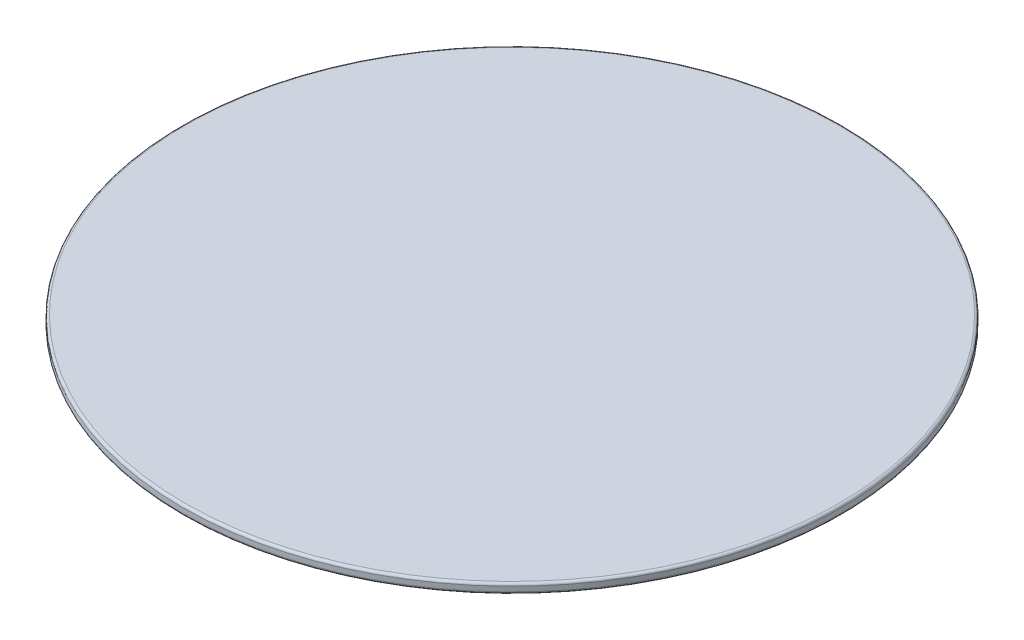
ISO-10303-21;
HEADER;
FILE_DESCRIPTION(('STEP AP214'),'2;1');
FILE_NAME('part.step','',(''),(''),'','','');
FILE_SCHEMA(('AUTOMOTIVE_DESIGN { 1 0 10303 214 1 1 1 1 }'));
ENDSEC;
DATA;
#1=APPLICATION_CONTEXT('core data for automotive mechanical design processes');
#2=APPLICATION_PROTOCOL_DEFINITION('international standard','automotive_design',2000,#1);
#3=PRODUCT_CONTEXT('',#1,'mechanical');
#4=PRODUCT('Part','Part','',(#3));
#5=PRODUCT_RELATED_PRODUCT_CATEGORY('part','',(#4));
#6=PRODUCT_DEFINITION_FORMATION('','',#4);
#7=PRODUCT_DEFINITION_CONTEXT('part definition',#1,'design');
#8=PRODUCT_DEFINITION('design','',#6,#7);
#9=PRODUCT_DEFINITION_SHAPE('','',#8);
#10=(LENGTH_UNIT() NAMED_UNIT(*) SI_UNIT(.MILLI.,.METRE.));
#11=(NAMED_UNIT(*) PLANE_ANGLE_UNIT() SI_UNIT($,.RADIAN.));
#12=(NAMED_UNIT(*) SI_UNIT($,.STERADIAN.) SOLID_ANGLE_UNIT());
#13=UNCERTAINTY_MEASURE_WITH_UNIT(LENGTH_MEASURE(1.E-05),#10,'distance_accuracy_value','');
#14=(GEOMETRIC_REPRESENTATION_CONTEXT(3) GLOBAL_UNCERTAINTY_ASSIGNED_CONTEXT((#13)) GLOBAL_UNIT_ASSIGNED_CONTEXT((#10,
#11,#12)) REPRESENTATION_CONTEXT('',''));
#15=CARTESIAN_POINT('',(0.,0.,0.));
#16=DIRECTION('',(0.,0.,1.));
#17=DIRECTION('',(1.,0.,0.));
#18=AXIS2_PLACEMENT_3D('',#15,#16,#17);
#19=CARTESIAN_POINT('',(0.,4.,0.));
#20=DIRECTION('',(0.,-1.,0.));
#21=DIRECTION('',(0.,0.,-1.));
#22=AXIS2_PLACEMENT_3D('',#19,#20,#21);
#23=CYLINDRICAL_SURFACE('',#22,135.);
#24=CARTESIAN_POINT('',(0.,3.,0.));
#25=DIRECTION('',(0.,1.,0.));
#26=DIRECTION('',(0.,0.,1.));
#27=AXIS2_PLACEMENT_3D('',#24,#25,#26);
#28=CIRCLE('',#27,135.);
#29=CARTESIAN_POINT('',(0.,3.,135.));
#30=VERTEX_POINT('',#29);
#31=EDGE_CURVE('E38',#30,#30,#28,.F.);
#32=ORIENTED_EDGE('',*,*,#31,.T.);
#33=EDGE_LOOP('',(#32));
#34=FACE_BOUND('',#33,.T.);
#35=CARTESIAN_POINT('',(0.,1.,0.));
#36=DIRECTION('',(0.,1.,0.));
#37=DIRECTION('',(0.,0.,1.));
#38=AXIS2_PLACEMENT_3D('',#35,#36,#37);
#39=CIRCLE('',#38,135.);
#40=CARTESIAN_POINT('',(0.,1.,135.));
#41=VERTEX_POINT('',#40);
#42=EDGE_CURVE('E42',#41,#41,#39,.T.);
#43=ORIENTED_EDGE('',*,*,#42,.T.);
#44=EDGE_LOOP('',(#43));
#45=FACE_BOUND('',#44,.T.);
#46=ADVANCED_FACE('F31',(#34,#45),#23,.T.);
#47=CARTESIAN_POINT('',(0.,4.,0.));
#48=DIRECTION('',(0.,1.,0.));
#49=DIRECTION('',(0.,0.,1.));
#50=AXIS2_PLACEMENT_3D('',#47,#48,#49);
#51=PLANE('',#50);
#52=CARTESIAN_POINT('',(0.,4.,0.));
#53=DIRECTION('',(0.,1.,0.));
#54=DIRECTION('',(0.,0.,1.));
#55=AXIS2_PLACEMENT_3D('',#52,#53,#54);
#56=CIRCLE('',#55,134.);
#57=CARTESIAN_POINT('',(0.,4.,134.));
#58=VERTEX_POINT('',#57);
#59=EDGE_CURVE('E46',#58,#58,#56,.T.);
#60=ORIENTED_EDGE('',*,*,#59,.T.);
#61=EDGE_LOOP('',(#60));
#62=FACE_BOUND('',#61,.T.);
#63=ADVANCED_FACE('F52',(#62),#51,.T.);
#64=CARTESIAN_POINT('',(0.,0.,0.));
#65=DIRECTION('',(0.,1.,0.));
#66=DIRECTION('',(0.,0.,1.));
#67=AXIS2_PLACEMENT_3D('',#64,#65,#66);
#68=PLANE('',#67);
#69=CARTESIAN_POINT('',(0.,0.,0.));
#70=DIRECTION('',(0.,1.,0.));
#71=DIRECTION('',(0.,0.,1.));
#72=AXIS2_PLACEMENT_3D('',#69,#70,#71);
#73=CIRCLE('',#72,134.);
#74=CARTESIAN_POINT('',(0.,0.,134.));
#75=VERTEX_POINT('',#74);
#76=EDGE_CURVE('E10',#75,#75,#73,.F.);
#77=ORIENTED_EDGE('',*,*,#76,.T.);
#78=EDGE_LOOP('',(#77));
#79=FACE_BOUND('',#78,.T.);
#80=ADVANCED_FACE('F56',(#79),#68,.F.);
#81=CARTESIAN_POINT('',(0.,3.,0.));
#82=DIRECTION('',(0.,1.,0.));
#83=DIRECTION('',(0.,0.,1.));
#84=AXIS2_PLACEMENT_3D('',#81,#82,#83);
#85=TOROIDAL_SURFACE('',#84,134.,1.);
#86=ORIENTED_EDGE('',*,*,#31,.F.);
#87=EDGE_LOOP('',(#86));
#88=FACE_BOUND('',#87,.T.);
#89=ORIENTED_EDGE('',*,*,#59,.F.);
#90=EDGE_LOOP('',(#89));
#91=FACE_BOUND('',#90,.T.);
#92=ADVANCED_FACE('F54',(#88,#91),#85,.T.);
#93=CARTESIAN_POINT('',(0.,1.,0.));
#94=DIRECTION('',(0.,1.,0.));
#95=DIRECTION('',(0.,0.,1.));
#96=AXIS2_PLACEMENT_3D('',#93,#94,#95);
#97=TOROIDAL_SURFACE('',#96,134.,1.);
#98=ORIENTED_EDGE('',*,*,#76,.F.);
#99=EDGE_LOOP('',(#98));
#100=FACE_BOUND('',#99,.T.);
#101=ORIENTED_EDGE('',*,*,#42,.F.);
#102=EDGE_LOOP('',(#101));
#103=FACE_BOUND('',#102,.T.);
#104=ADVANCED_FACE('F33',(#100,#103),#97,.T.);
#105=CLOSED_SHELL('',(#46,#63,#80,#92,#104));
#106=MANIFOLD_SOLID_BREP('B2',#105);
#107=ADVANCED_BREP_SHAPE_REPRESENTATION('',(#18,#106),#14);
#108=SHAPE_DEFINITION_REPRESENTATION(#9,#107);
ENDSEC;
END-ISO-10303-21;
